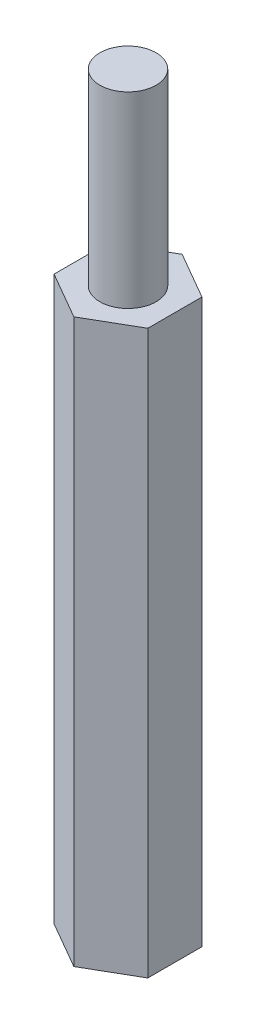
ISO-10303-21;
HEADER;
FILE_DESCRIPTION(('STEP AP214'),'2;1');
FILE_NAME('part.step','',(''),(''),'','','');
FILE_SCHEMA(('AUTOMOTIVE_DESIGN { 1 0 10303 214 1 1 1 1 }'));
ENDSEC;
DATA;
#1=APPLICATION_CONTEXT('core data for automotive mechanical design processes');
#2=APPLICATION_PROTOCOL_DEFINITION('international standard','automotive_design',2000,#1);
#3=PRODUCT_CONTEXT('',#1,'mechanical');
#4=PRODUCT('Part','Part','',(#3));
#5=PRODUCT_RELATED_PRODUCT_CATEGORY('part','',(#4));
#6=PRODUCT_DEFINITION_FORMATION('','',#4);
#7=PRODUCT_DEFINITION_CONTEXT('part definition',#1,'design');
#8=PRODUCT_DEFINITION('design','',#6,#7);
#9=PRODUCT_DEFINITION_SHAPE('','',#8);
#10=(LENGTH_UNIT() NAMED_UNIT(*) SI_UNIT(.MILLI.,.METRE.));
#11=(NAMED_UNIT(*) PLANE_ANGLE_UNIT() SI_UNIT($,.RADIAN.));
#12=(NAMED_UNIT(*) SI_UNIT($,.STERADIAN.) SOLID_ANGLE_UNIT());
#13=UNCERTAINTY_MEASURE_WITH_UNIT(LENGTH_MEASURE(1.E-05),#10,'distance_accuracy_value','');
#14=(GEOMETRIC_REPRESENTATION_CONTEXT(3) GLOBAL_UNCERTAINTY_ASSIGNED_CONTEXT((#13)) GLOBAL_UNIT_ASSIGNED_CONTEXT((#10,
#11,#12)) REPRESENTATION_CONTEXT('',''));
#15=CARTESIAN_POINT('',(0.,0.,0.));
#16=DIRECTION('',(0.,0.,1.));
#17=DIRECTION('',(1.,0.,0.));
#18=AXIS2_PLACEMENT_3D('',#15,#16,#17);
#19=CARTESIAN_POINT('',(0.,30.,0.));
#20=DIRECTION('',(0.,1.,0.));
#21=DIRECTION('',(0.,0.,1.));
#22=AXIS2_PLACEMENT_3D('',#19,#20,#21);
#23=PLANE('',#22);
#24=DIRECTION('',(0.866025403784439,0.,-0.5));
#25=VECTOR('',#24,1.);
#26=CARTESIAN_POINT('',(0.,30.,2.88675134594813));
#27=LINE('',#26,#25);
#28=CARTESIAN_POINT('',(0.,30.,2.88675134594813));
#29=VERTEX_POINT('',#28);
#30=CARTESIAN_POINT('',(2.5,30.,1.44337567297407));
#31=VERTEX_POINT('',#30);
#32=EDGE_CURVE('E129',#29,#31,#27,.T.);
#33=ORIENTED_EDGE('',*,*,#32,.T.);
#34=DIRECTION('',(0.,0.,-1.));
#35=VECTOR('',#34,1.);
#36=CARTESIAN_POINT('',(2.5,30.,1.44337567297407));
#37=LINE('',#36,#35);
#38=CARTESIAN_POINT('',(2.5,30.,-1.44337567297407));
#39=VERTEX_POINT('',#38);
#40=EDGE_CURVE('E87',#31,#39,#37,.T.);
#41=ORIENTED_EDGE('',*,*,#40,.T.);
#42=DIRECTION('',(-0.866025403784439,0.,-0.5));
#43=VECTOR('',#42,1.);
#44=CARTESIAN_POINT('',(2.5,30.,-1.44337567297407));
#45=LINE('',#44,#43);
#46=CARTESIAN_POINT('',(0.,30.,-2.88675134594813));
#47=VERTEX_POINT('',#46);
#48=EDGE_CURVE('E100',#39,#47,#45,.T.);
#49=ORIENTED_EDGE('',*,*,#48,.T.);
#50=DIRECTION('',(-0.866025403784439,0.,0.5));
#51=VECTOR('',#50,1.);
#52=CARTESIAN_POINT('',(0.,30.,-2.88675134594813));
#53=LINE('',#52,#51);
#54=CARTESIAN_POINT('',(-2.5,30.,-1.44337567297406));
#55=VERTEX_POINT('',#54);
#56=EDGE_CURVE('E94',#47,#55,#53,.T.);
#57=ORIENTED_EDGE('',*,*,#56,.T.);
#58=DIRECTION('',(0.,0.,1.));
#59=VECTOR('',#58,1.);
#60=CARTESIAN_POINT('',(-2.5,30.,-1.44337567297406));
#61=LINE('',#60,#59);
#62=CARTESIAN_POINT('',(-2.5,30.,1.44337567297406));
#63=VERTEX_POINT('',#62);
#64=EDGE_CURVE('E98',#55,#63,#61,.T.);
#65=ORIENTED_EDGE('',*,*,#64,.T.);
#66=DIRECTION('',(0.866025403784438,0.,0.5));
#67=VECTOR('',#66,1.);
#68=CARTESIAN_POINT('',(-2.5,30.,1.44337567297406));
#69=LINE('',#68,#67);
#70=EDGE_CURVE('E50',#63,#29,#69,.T.);
#71=ORIENTED_EDGE('',*,*,#70,.T.);
#72=EDGE_LOOP('',(#33,#41,#49,#57,#65,#71));
#73=FACE_BOUND('',#72,.T.);
#74=CARTESIAN_POINT('',(0.,30.,0.));
#75=DIRECTION('',(0.,1.,0.));
#76=DIRECTION('',(0.,0.,1.));
#77=AXIS2_PLACEMENT_3D('',#74,#75,#76);
#78=CIRCLE('',#77,1.5);
#79=CARTESIAN_POINT('',(0.,30.,1.5));
#80=VERTEX_POINT('',#79);
#81=EDGE_CURVE('E180',#80,#80,#78,.T.);
#82=ORIENTED_EDGE('',*,*,#81,.F.);
#83=EDGE_LOOP('',(#82));
#84=FACE_BOUND('',#83,.T.);
#85=ADVANCED_FACE('F33',(#73,#84),#23,.T.);
#86=CARTESIAN_POINT('',(0.,30.,2.88675134594813));
#87=DIRECTION('',(-0.5,0.,-0.866025403784439));
#88=DIRECTION('',(-0.866025403784439,0.,0.5));
#89=AXIS2_PLACEMENT_3D('',#86,#87,#88);
#90=PLANE('',#89);
#91=DIRECTION('',(0.866025403784439,0.,-0.5));
#92=VECTOR('',#91,1.);
#93=CARTESIAN_POINT('',(0.,0.,2.88675134594813));
#94=LINE('',#93,#92);
#95=CARTESIAN_POINT('',(0.,0.,2.88675134594813));
#96=VERTEX_POINT('',#95);
#97=CARTESIAN_POINT('',(2.5,0.,1.44337567297407));
#98=VERTEX_POINT('',#97);
#99=EDGE_CURVE('E118',#96,#98,#94,.T.);
#100=ORIENTED_EDGE('',*,*,#99,.T.);
#101=DIRECTION('',(0.,-1.,0.));
#102=VECTOR('',#101,1.);
#103=CARTESIAN_POINT('',(2.5,30.,1.44337567297407));
#104=LINE('',#103,#102);
#105=EDGE_CURVE('E11',#31,#98,#104,.T.);
#106=ORIENTED_EDGE('',*,*,#105,.F.);
#107=ORIENTED_EDGE('',*,*,#32,.F.);
#108=DIRECTION('',(0.,-1.,0.));
#109=VECTOR('',#108,1.);
#110=CARTESIAN_POINT('',(0.,30.,2.88675134594813));
#111=LINE('',#110,#109);
#112=EDGE_CURVE('E114',#29,#96,#111,.T.);
#113=ORIENTED_EDGE('',*,*,#112,.T.);
#114=EDGE_LOOP('',(#100,#106,#107,#113));
#115=FACE_BOUND('',#114,.T.);
#116=ADVANCED_FACE('F35',(#115),#90,.F.);
#117=CARTESIAN_POINT('',(2.5,30.,1.44337567297407));
#118=DIRECTION('',(-1.,0.,0.));
#119=DIRECTION('',(0.,0.,1.));
#120=AXIS2_PLACEMENT_3D('',#117,#118,#119);
#121=PLANE('',#120);
#122=DIRECTION('',(0.,0.,-1.));
#123=VECTOR('',#122,1.);
#124=CARTESIAN_POINT('',(2.5,0.,1.44337567297407));
#125=LINE('',#124,#123);
#126=CARTESIAN_POINT('',(2.5,0.,-1.44337567297407));
#127=VERTEX_POINT('',#126);
#128=EDGE_CURVE('E121',#98,#127,#125,.T.);
#129=ORIENTED_EDGE('',*,*,#128,.T.);
#130=DIRECTION('',(0.,-1.,0.));
#131=VECTOR('',#130,1.);
#132=CARTESIAN_POINT('',(2.5,30.,-1.44337567297407));
#133=LINE('',#132,#131);
#134=EDGE_CURVE('E42',#39,#127,#133,.T.);
#135=ORIENTED_EDGE('',*,*,#134,.F.);
#136=ORIENTED_EDGE('',*,*,#40,.F.);
#137=ORIENTED_EDGE('',*,*,#105,.T.);
#138=EDGE_LOOP('',(#129,#135,#136,#137));
#139=FACE_BOUND('',#138,.T.);
#140=ADVANCED_FACE('F159',(#139),#121,.F.);
#141=CARTESIAN_POINT('',(2.5,30.,-1.44337567297407));
#142=DIRECTION('',(-0.5,0.,0.866025403784439));
#143=DIRECTION('',(0.866025403784439,0.,0.5));
#144=AXIS2_PLACEMENT_3D('',#141,#142,#143);
#145=PLANE('',#144);
#146=DIRECTION('',(-0.866025403784439,0.,-0.5));
#147=VECTOR('',#146,1.);
#148=CARTESIAN_POINT('',(2.5,0.,-1.44337567297407));
#149=LINE('',#148,#147);
#150=CARTESIAN_POINT('',(0.,0.,-2.88675134594813));
#151=VERTEX_POINT('',#150);
#152=EDGE_CURVE('E124',#127,#151,#149,.T.);
#153=ORIENTED_EDGE('',*,*,#152,.T.);
#154=DIRECTION('',(0.,-1.,0.));
#155=VECTOR('',#154,1.);
#156=CARTESIAN_POINT('',(0.,30.,-2.88675134594813));
#157=LINE('',#156,#155);
#158=EDGE_CURVE('E109',#47,#151,#157,.T.);
#159=ORIENTED_EDGE('',*,*,#158,.F.);
#160=ORIENTED_EDGE('',*,*,#48,.F.);
#161=ORIENTED_EDGE('',*,*,#134,.T.);
#162=EDGE_LOOP('',(#153,#159,#160,#161));
#163=FACE_BOUND('',#162,.T.);
#164=ADVANCED_FACE('F135',(#163),#145,.F.);
#165=CARTESIAN_POINT('',(0.,30.,-2.88675134594813));
#166=DIRECTION('',(0.5,0.,0.866025403784439));
#167=DIRECTION('',(0.866025403784439,0.,-0.5));
#168=AXIS2_PLACEMENT_3D('',#165,#166,#167);
#169=PLANE('',#168);
#170=DIRECTION('',(-0.866025403784439,0.,0.5));
#171=VECTOR('',#170,1.);
#172=CARTESIAN_POINT('',(0.,0.,-2.88675134594813));
#173=LINE('',#172,#171);
#174=CARTESIAN_POINT('',(-2.5,0.,-1.44337567297406));
#175=VERTEX_POINT('',#174);
#176=EDGE_CURVE('E108',#151,#175,#173,.T.);
#177=ORIENTED_EDGE('',*,*,#176,.T.);
#178=DIRECTION('',(0.,-1.,0.));
#179=VECTOR('',#178,1.);
#180=CARTESIAN_POINT('',(-2.5,30.,-1.44337567297406));
#181=LINE('',#180,#179);
#182=EDGE_CURVE('E105',#55,#175,#181,.T.);
#183=ORIENTED_EDGE('',*,*,#182,.F.);
#184=ORIENTED_EDGE('',*,*,#56,.F.);
#185=ORIENTED_EDGE('',*,*,#158,.T.);
#186=EDGE_LOOP('',(#177,#183,#184,#185));
#187=FACE_BOUND('',#186,.T.);
#188=ADVANCED_FACE('F106',(#187),#169,.F.);
#189=CARTESIAN_POINT('',(-2.5,30.,-1.44337567297406));
#190=DIRECTION('',(1.,0.,0.));
#191=DIRECTION('',(0.,0.,-1.));
#192=AXIS2_PLACEMENT_3D('',#189,#190,#191);
#193=PLANE('',#192);
#194=DIRECTION('',(0.,0.,1.));
#195=VECTOR('',#194,1.);
#196=CARTESIAN_POINT('',(-2.5,0.,-1.44337567297406));
#197=LINE('',#196,#195);
#198=CARTESIAN_POINT('',(-2.5,0.,1.44337567297406));
#199=VERTEX_POINT('',#198);
#200=EDGE_CURVE('E73',#175,#199,#197,.T.);
#201=ORIENTED_EDGE('',*,*,#200,.T.);
#202=DIRECTION('',(0.,-1.,0.));
#203=VECTOR('',#202,1.);
#204=CARTESIAN_POINT('',(-2.5,30.,1.44337567297406));
#205=LINE('',#204,#203);
#206=EDGE_CURVE('E110',#63,#199,#205,.T.);
#207=ORIENTED_EDGE('',*,*,#206,.F.);
#208=ORIENTED_EDGE('',*,*,#64,.F.);
#209=ORIENTED_EDGE('',*,*,#182,.T.);
#210=EDGE_LOOP('',(#201,#207,#208,#209));
#211=FACE_BOUND('',#210,.T.);
#212=ADVANCED_FACE('F112',(#211),#193,.F.);
#213=CARTESIAN_POINT('',(-2.5,30.,1.44337567297406));
#214=DIRECTION('',(0.5,0.,-0.866025403784439));
#215=DIRECTION('',(-0.866025403784439,0.,-0.5));
#216=AXIS2_PLACEMENT_3D('',#213,#214,#215);
#217=PLANE('',#216);
#218=DIRECTION('',(0.866025403784438,0.,0.5));
#219=VECTOR('',#218,1.);
#220=CARTESIAN_POINT('',(-2.5,0.,1.44337567297406));
#221=LINE('',#220,#219);
#222=EDGE_CURVE('E79',#199,#96,#221,.T.);
#223=ORIENTED_EDGE('',*,*,#222,.T.);
#224=ORIENTED_EDGE('',*,*,#112,.F.);
#225=ORIENTED_EDGE('',*,*,#70,.F.);
#226=ORIENTED_EDGE('',*,*,#206,.T.);
#227=EDGE_LOOP('',(#223,#224,#225,#226));
#228=FACE_BOUND('',#227,.T.);
#229=ADVANCED_FACE('F142',(#228),#217,.F.);
#230=CARTESIAN_POINT('',(0.,0.,0.));
#231=DIRECTION('',(0.,1.,0.));
#232=DIRECTION('',(0.,0.,1.));
#233=AXIS2_PLACEMENT_3D('',#230,#231,#232);
#234=PLANE('',#233);
#235=CARTESIAN_POINT('',(0.,0.,0.));
#236=DIRECTION('',(0.,-1.,0.));
#237=DIRECTION('',(0.,0.,-1.));
#238=AXIS2_PLACEMENT_3D('',#235,#236,#237);
#239=CIRCLE('',#238,1.5);
#240=CARTESIAN_POINT('',(0.,0.,-1.5));
#241=VERTEX_POINT('',#240);
#242=EDGE_CURVE('E181',#241,#241,#239,.T.);
#243=ORIENTED_EDGE('',*,*,#242,.F.);
#244=EDGE_LOOP('',(#243));
#245=FACE_BOUND('',#244,.T.);
#246=ORIENTED_EDGE('',*,*,#99,.F.);
#247=ORIENTED_EDGE('',*,*,#222,.F.);
#248=ORIENTED_EDGE('',*,*,#200,.F.);
#249=ORIENTED_EDGE('',*,*,#176,.F.);
#250=ORIENTED_EDGE('',*,*,#152,.F.);
#251=ORIENTED_EDGE('',*,*,#128,.F.);
#252=EDGE_LOOP('',(#246,#247,#248,#249,#250,#251));
#253=FACE_BOUND('',#252,.T.);
#254=ADVANCED_FACE('F138',(#245,#253),#234,.F.);
#255=CARTESIAN_POINT('',(0.,40.,0.));
#256=DIRECTION('',(0.,-1.,0.));
#257=DIRECTION('',(0.,0.,-1.));
#258=AXIS2_PLACEMENT_3D('',#255,#256,#257);
#259=CYLINDRICAL_SURFACE('',#258,1.5);
#260=CARTESIAN_POINT('',(0.,40.,0.));
#261=DIRECTION('',(0.,1.,0.));
#262=DIRECTION('',(0.,0.,1.));
#263=AXIS2_PLACEMENT_3D('',#260,#261,#262);
#264=CIRCLE('',#263,1.5);
#265=CARTESIAN_POINT('',(0.,40.,1.5));
#266=VERTEX_POINT('',#265);
#267=EDGE_CURVE('E122',#266,#266,#264,.T.);
#268=ORIENTED_EDGE('',*,*,#267,.F.);
#269=EDGE_LOOP('',(#268));
#270=FACE_BOUND('',#269,.T.);
#271=ORIENTED_EDGE('',*,*,#81,.T.);
#272=EDGE_LOOP('',(#271));
#273=FACE_BOUND('',#272,.T.);
#274=ADVANCED_FACE('F150',(#270,#273),#259,.T.);
#275=CARTESIAN_POINT('',(0.,40.,0.));
#276=DIRECTION('',(0.,1.,0.));
#277=DIRECTION('',(0.,0.,1.));
#278=AXIS2_PLACEMENT_3D('',#275,#276,#277);
#279=PLANE('',#278);
#280=ORIENTED_EDGE('',*,*,#267,.T.);
#281=EDGE_LOOP('',(#280));
#282=FACE_BOUND('',#281,.T.);
#283=ADVANCED_FACE('F163',(#282),#279,.T.);
#284=CARTESIAN_POINT('',(0.,10.,0.));
#285=DIRECTION('',(0.,-1.,0.));
#286=DIRECTION('',(0.,0.,-1.));
#287=AXIS2_PLACEMENT_3D('',#284,#285,#286);
#288=CYLINDRICAL_SURFACE('',#287,1.5);
#289=CARTESIAN_POINT('',(0.,10.,0.));
#290=DIRECTION('',(0.,-1.,0.));
#291=DIRECTION('',(0.,0.,-1.));
#292=AXIS2_PLACEMENT_3D('',#289,#290,#291);
#293=CIRCLE('',#292,1.5);
#294=CARTESIAN_POINT('',(0.,10.,-1.5));
#295=VERTEX_POINT('',#294);
#296=EDGE_CURVE('E179',#295,#295,#293,.T.);
#297=ORIENTED_EDGE('',*,*,#296,.F.);
#298=EDGE_LOOP('',(#297));
#299=FACE_BOUND('',#298,.T.);
#300=ORIENTED_EDGE('',*,*,#242,.T.);
#301=EDGE_LOOP('',(#300));
#302=FACE_BOUND('',#301,.T.);
#303=ADVANCED_FACE('F167',(#299,#302),#288,.F.);
#304=CARTESIAN_POINT('',(0.,10.,0.));
#305=DIRECTION('',(0.,-1.,0.));
#306=DIRECTION('',(0.,0.,-1.));
#307=AXIS2_PLACEMENT_3D('',#304,#305,#306);
#308=PLANE('',#307);
#309=ORIENTED_EDGE('',*,*,#296,.T.);
#310=EDGE_LOOP('',(#309));
#311=FACE_BOUND('',#310,.T.);
#312=ADVANCED_FACE('F171',(#311),#308,.T.);
#313=CLOSED_SHELL('',(#85,#116,#140,#164,#188,#212,#229,#254,#274,#283,#303,#312));
#314=MANIFOLD_SOLID_BREP('B2',#313);
#315=ADVANCED_BREP_SHAPE_REPRESENTATION('',(#18,#314),#14);
#316=SHAPE_DEFINITION_REPRESENTATION(#9,#315);
ENDSEC;
END-ISO-10303-21;
